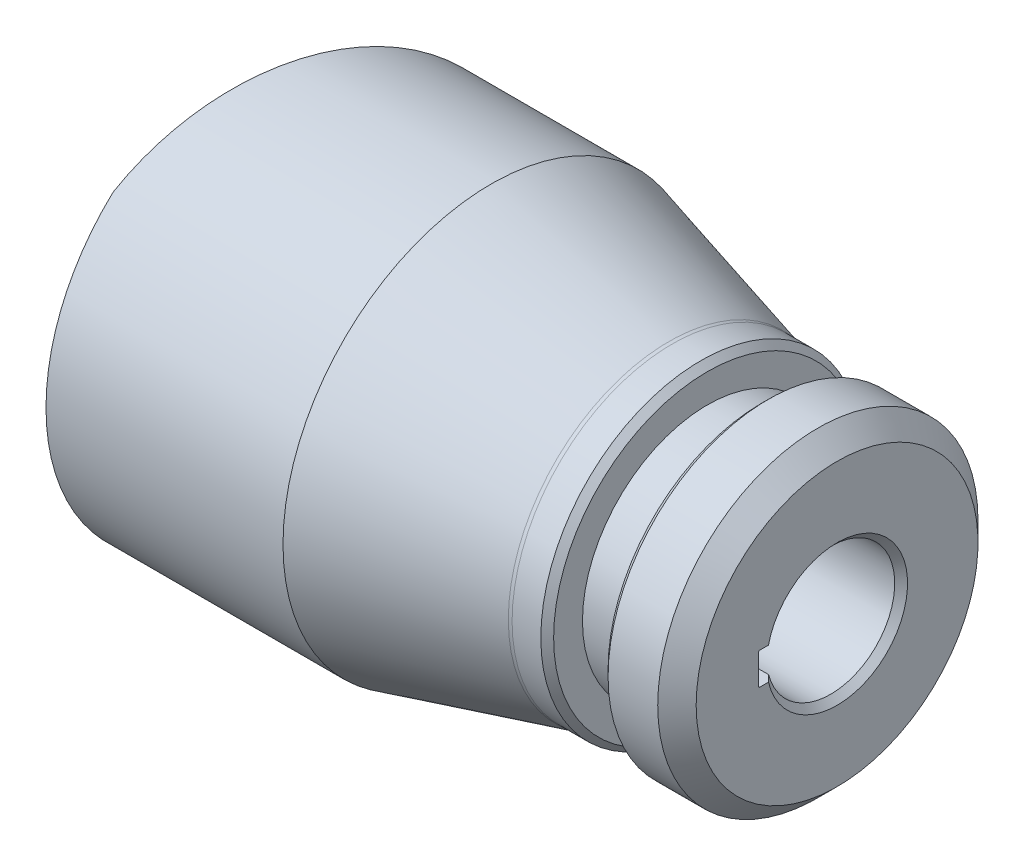
ISO-10303-21;
HEADER;
FILE_DESCRIPTION(('STEP AP214'),'2;1');
FILE_NAME('part.step','',(''),(''),'','','');
FILE_SCHEMA(('AUTOMOTIVE_DESIGN { 1 0 10303 214 1 1 1 1 }'));
ENDSEC;
DATA;
#1=APPLICATION_CONTEXT('core data for automotive mechanical design processes');
#2=APPLICATION_PROTOCOL_DEFINITION('international standard','automotive_design',2000,#1);
#3=PRODUCT_CONTEXT('',#1,'mechanical');
#4=PRODUCT('Part','Part','',(#3));
#5=PRODUCT_RELATED_PRODUCT_CATEGORY('part','',(#4));
#6=PRODUCT_DEFINITION_FORMATION('','',#4);
#7=PRODUCT_DEFINITION_CONTEXT('part definition',#1,'design');
#8=PRODUCT_DEFINITION('design','',#6,#7);
#9=PRODUCT_DEFINITION_SHAPE('','',#8);
#10=(LENGTH_UNIT() NAMED_UNIT(*) SI_UNIT(.MILLI.,.METRE.));
#11=(NAMED_UNIT(*) PLANE_ANGLE_UNIT() SI_UNIT($,.RADIAN.));
#12=(NAMED_UNIT(*) SI_UNIT($,.STERADIAN.) SOLID_ANGLE_UNIT());
#13=UNCERTAINTY_MEASURE_WITH_UNIT(LENGTH_MEASURE(1.E-05),#10,'distance_accuracy_value','');
#14=(GEOMETRIC_REPRESENTATION_CONTEXT(3) GLOBAL_UNCERTAINTY_ASSIGNED_CONTEXT((#13)) GLOBAL_UNIT_ASSIGNED_CONTEXT((#10,
#11,#12)) REPRESENTATION_CONTEXT('',''));
#15=CARTESIAN_POINT('',(0.,0.,0.));
#16=DIRECTION('',(0.,0.,1.));
#17=DIRECTION('',(1.,0.,0.));
#18=AXIS2_PLACEMENT_3D('',#15,#16,#17);
#19=CARTESIAN_POINT('',(61.,10.,0.));
#20=DIRECTION('',(1.,0.,0.));
#21=DIRECTION('',(0.,0.,-1.));
#22=AXIS2_PLACEMENT_3D('',#19,#20,#21);
#23=PLANE('',#22);
#24=CARTESIAN_POINT('',(61.,0.,0.));
#25=DIRECTION('',(-1.,0.,0.));
#26=DIRECTION('',(0.,0.,1.));
#27=AXIS2_PLACEMENT_3D('',#24,#25,#26);
#28=CIRCLE('',#27,19.);
#29=CARTESIAN_POINT('',(61.,0.,19.));
#30=VERTEX_POINT('',#29);
#31=EDGE_CURVE('E228',#30,#30,#28,.T.);
#32=ORIENTED_EDGE('',*,*,#31,.T.);
#33=EDGE_LOOP('',(#32));
#34=FACE_BOUND('',#33,.T.);
#35=CARTESIAN_POINT('',(61.,-2.25,12.05));
#36=DIRECTION('',(1.,0.,0.));
#37=DIRECTION('',(0.,0.,-1.));
#38=AXIS2_PLACEMENT_3D('',#35,#36,#37);
#39=CIRCLE('',#38,0.25);
#40=CARTESIAN_POINT('',(61.,-2.25,12.3));
#41=VERTEX_POINT('',#40);
#42=CARTESIAN_POINT('',(61.,-2.5,12.05));
#43=VERTEX_POINT('',#42);
#44=EDGE_CURVE('E137',#41,#43,#39,.T.);
#45=ORIENTED_EDGE('',*,*,#44,.T.);
#46=DIRECTION('',(0.,0.,-1.));
#47=VECTOR('',#46,1.);
#48=CARTESIAN_POINT('',(61.,-2.5,12.05));
#49=LINE('',#48,#47);
#50=CARTESIAN_POINT('',(61.,-2.5,9.68245836551854));
#51=VERTEX_POINT('',#50);
#52=EDGE_CURVE('E132',#43,#51,#49,.T.);
#53=ORIENTED_EDGE('',*,*,#52,.T.);
#54=CARTESIAN_POINT('',(61.,0.,0.));
#55=DIRECTION('',(-1.,0.,0.));
#56=DIRECTION('',(0.,0.,1.));
#57=AXIS2_PLACEMENT_3D('',#54,#55,#56);
#58=CIRCLE('',#57,10.);
#59=CARTESIAN_POINT('',(61.,2.5,9.68245836551854));
#60=VERTEX_POINT('',#59);
#61=EDGE_CURVE('E131',#60,#51,#58,.T.);
#62=ORIENTED_EDGE('',*,*,#61,.F.);
#63=DIRECTION('',(0.,0.,1.));
#64=VECTOR('',#63,1.);
#65=CARTESIAN_POINT('',(61.,2.5,0.));
#66=LINE('',#65,#64);
#67=CARTESIAN_POINT('',(61.,2.5,12.05));
#68=VERTEX_POINT('',#67);
#69=EDGE_CURVE('E115',#60,#68,#66,.T.);
#70=ORIENTED_EDGE('',*,*,#69,.T.);
#71=CARTESIAN_POINT('',(61.,2.25,12.05));
#72=DIRECTION('',(1.,0.,0.));
#73=DIRECTION('',(0.,0.,-1.));
#74=AXIS2_PLACEMENT_3D('',#71,#72,#73);
#75=CIRCLE('',#74,0.25);
#76=CARTESIAN_POINT('',(61.,2.25,12.3));
#77=VERTEX_POINT('',#76);
#78=EDGE_CURVE('E121',#68,#77,#75,.T.);
#79=ORIENTED_EDGE('',*,*,#78,.T.);
#80=DIRECTION('',(0.,-1.,0.));
#81=VECTOR('',#80,1.);
#82=CARTESIAN_POINT('',(61.,2.25,12.3));
#83=LINE('',#82,#81);
#84=EDGE_CURVE('E130',#77,#41,#83,.T.);
#85=ORIENTED_EDGE('',*,*,#84,.T.);
#86=EDGE_LOOP('',(#45,#53,#62,#70,#79,#85));
#87=FACE_BOUND('',#86,.T.);
#88=ADVANCED_FACE('F39',(#34,#87),#23,.F.);
#89=CARTESIAN_POINT('',(0.,0.,0.));
#90=DIRECTION('',(-1.,0.,0.));
#91=DIRECTION('',(0.,0.,1.));
#92=AXIS2_PLACEMENT_3D('',#89,#90,#91);
#93=CYLINDRICAL_SURFACE('',#92,10.);
#94=DIRECTION('',(-1.,0.,0.));
#95=VECTOR('',#94,1.);
#96=CARTESIAN_POINT('',(0.,-2.5,9.68245836551854));
#97=LINE('',#96,#95);
#98=CARTESIAN_POINT('',(90.,-2.5,9.68245836551854));
#99=VERTEX_POINT('',#98);
#100=EDGE_CURVE('E176',#99,#51,#97,.T.);
#101=ORIENTED_EDGE('',*,*,#100,.F.);
#102=CARTESIAN_POINT('',(90.,0.,0.));
#103=DIRECTION('',(-1.,0.,0.));
#104=DIRECTION('',(0.,0.,1.));
#105=AXIS2_PLACEMENT_3D('',#102,#103,#104);
#106=CIRCLE('',#105,10.);
#107=CARTESIAN_POINT('',(90.,2.5,9.68245836551854));
#108=VERTEX_POINT('',#107);
#109=EDGE_CURVE('E225',#108,#99,#106,.T.);
#110=ORIENTED_EDGE('',*,*,#109,.F.);
#111=DIRECTION('',(-1.,0.,0.));
#112=VECTOR('',#111,1.);
#113=CARTESIAN_POINT('',(0.,2.5,9.68245836551854));
#114=LINE('',#113,#112);
#115=EDGE_CURVE('E155',#60,#108,#114,.F.);
#116=ORIENTED_EDGE('',*,*,#115,.F.);
#117=ORIENTED_EDGE('',*,*,#61,.T.);
#118=EDGE_LOOP('',(#101,#110,#116,#117));
#119=FACE_BOUND('',#118,.T.);
#120=ADVANCED_FACE('F266',(#119),#93,.F.);
#121=CARTESIAN_POINT('',(90.,0.,0.));
#122=DIRECTION('',(1.,0.,0.));
#123=DIRECTION('',(0.,0.,-1.));
#124=AXIS2_PLACEMENT_3D('',#121,#122,#123);
#125=CONICAL_SURFACE('',#124,10.,0.785398163397447);
#126=CARTESIAN_POINT('',(102.045561017187,-2.5,21.9033504414856));
#127=CARTESIAN_POINT('',(101.449870446215,-2.5,21.3037783460764));
#128=CARTESIAN_POINT('',(100.854324898053,-2.5,20.7040619931697));
#129=CARTESIAN_POINT('',(99.6635375559575,-2.5,19.5041110312237));
#130=CARTESIAN_POINT('',(99.0682958370964,-2.5,18.9038763476916));
#131=CARTESIAN_POINT('',(97.8760221457398,-2.5,17.7005309154406));
#132=CARTESIAN_POINT('',(97.2789922658939,-2.5,17.0974180929501));
#133=CARTESIAN_POINT('',(96.0857744996463,-2.5,15.8905745919997));
#134=CARTESIAN_POINT('',(95.4895864810006,-2.5,15.2868440443333));
#135=CARTESIAN_POINT('',(94.4346485898976,-2.5,14.2167217543766));
#136=CARTESIAN_POINT('',(93.9756881287908,-2.5,13.7505376591703));
#137=CARTESIAN_POINT('',(93.0585903370607,-2.5,12.8173416722738));
#138=CARTESIAN_POINT('',(92.6004530233315,-2.5,12.3503297639757));
#139=CARTESIAN_POINT('',(91.6850309742706,-2.5,11.4148702783134));
#140=CARTESIAN_POINT('',(91.2277469954926,-2.5,10.9464219600604));
#141=CARTESIAN_POINT('',(90.3148861875787,-2.5,10.0079342569333));
#142=CARTESIAN_POINT('',(89.8593092298857,-2.5,9.53789499716365));
#143=CARTESIAN_POINT('',(88.9523494751294,-2.5,8.59711263543488));
#144=CARTESIAN_POINT('',(88.5009574133,-2.5,8.12637848838384));
#145=CARTESIAN_POINT('',(87.8269019453231,-2.5,7.4172560158198));
#146=CARTESIAN_POINT('',(87.6026883899942,-2.5,7.18034208959313));
#147=CARTESIAN_POINT('',(87.1556525924263,-2.5,6.70521258252492));
#148=CARTESIAN_POINT('',(86.9328303232039,-2.5,6.46699702709683));
#149=CARTESIAN_POINT('',(86.4893544719267,-2.5,5.98912775716134));
#150=CARTESIAN_POINT('',(86.2686984487696,-2.5,5.74947631274653));
#151=CARTESIAN_POINT('',(85.8300192665262,-2.5,5.26773614577968));
#152=CARTESIAN_POINT('',(85.6119963259971,-2.5,5.02564722392351));
#153=CARTESIAN_POINT('',(85.1799421292042,-2.5,4.53813526469688));
#154=CARTESIAN_POINT('',(84.9659088435389,-2.5,4.29271403860861));
#155=CARTESIAN_POINT('',(84.6494717760518,-2.5,3.92068538051081));
#156=CARTESIAN_POINT('',(84.544768684024,-2.5,3.7960351611092));
#157=CARTESIAN_POINT('',(84.3373550207405,-2.5,3.54509019573787));
#158=CARTESIAN_POINT('',(84.2346443575069,-2.5,3.41879552613407));
#159=CARTESIAN_POINT('',(84.0949780157451,-2.5,3.24340610425404));
#160=CARTESIAN_POINT('',(84.0568990373237,-2.5,3.19520488318342));
#161=CARTESIAN_POINT('',(83.9811594306527,-2.5,3.0984732096231));
#162=CARTESIAN_POINT('',(83.9434988117545,-2.5,3.04994274981301));
#163=CARTESIAN_POINT('',(83.8312131001724,-2.5,2.9038061080311));
#164=CARTESIAN_POINT('',(83.7572879230694,-2.5,2.80565938066392));
#165=CARTESIAN_POINT('',(83.6116206604259,-2.5,2.60736322707545));
#166=CARTESIAN_POINT('',(83.5398846990809,-2.5,2.50720928734453));
#167=CARTESIAN_POINT('',(83.3994981168775,-2.5,2.30475848848419));
#168=CARTESIAN_POINT('',(83.3308473157947,-2.5,2.20246175504244));
#169=CARTESIAN_POINT('',(83.1996821734027,-2.5,1.99846925459172));
#170=CARTESIAN_POINT('',(83.1370432716504,-2.5,1.89685410017203));
#171=CARTESIAN_POINT('',(83.0168053808059,-2.5,1.6906036686147));
#172=CARTESIAN_POINT('',(82.9592082432841,-2.5,1.58596730055157));
#173=CARTESIAN_POINT('',(82.851057399586,-2.5,1.37362506179184));
#174=CARTESIAN_POINT('',(82.800475315056,-2.5,1.26593381571607));
#175=CARTESIAN_POINT('',(82.7084728205532,-2.5,1.04675068999883));
#176=CARTESIAN_POINT('',(82.6670418539287,-2.5,0.93526336273527));
#177=CARTESIAN_POINT('',(82.6090268657202,-2.5,0.74949796271908));
#178=CARTESIAN_POINT('',(82.5888746879037,-2.5,0.676335800473273));
#179=CARTESIAN_POINT('',(82.5542738118671,-2.5,0.528644072222774));
#180=CARTESIAN_POINT('',(82.5398257733874,-2.5,0.454114349088667));
#181=CARTESIAN_POINT('',(82.5173797387102,-2.5,0.304389254153665));
#182=CARTESIAN_POINT('',(82.5093555155451,-2.5,0.229197869332127));
#183=CARTESIAN_POINT('',(82.5000968878634,-2.5,0.0783950146710749));
#184=CARTESIAN_POINT('',(82.4988621261968,-2.5,0.0027835671378271));
#185=CARTESIAN_POINT('',(82.5032552583313,-2.5,-0.148311352858782));
#186=CARTESIAN_POINT('',(82.5088899423716,-2.5,-0.223794624722243));
#187=CARTESIAN_POINT('',(82.5267161267743,-2.5,-0.373974966506095));
#188=CARTESIAN_POINT('',(82.5389080647435,-2.5,-0.448671983615511));
#189=CARTESIAN_POINT('',(82.5692990787695,-2.5,-0.597167582870771));
#190=CARTESIAN_POINT('',(82.5875248464607,-2.5,-0.670960634354447));
#191=CARTESIAN_POINT('',(82.6291922122467,-2.5,-0.817036970277688));
#192=CARTESIAN_POINT('',(82.6526340214481,-2.5,-0.889320193481054));
#193=CARTESIAN_POINT('',(82.7388087960089,-2.5,-1.12958668720317));
#194=CARTESIAN_POINT('',(82.811608747054,-2.5,-1.29398154860926));
#195=CARTESIAN_POINT('',(82.9325594311706,-2.5,-1.53449963527309));
#196=CARTESIAN_POINT('',(82.9748938967031,-2.5,-1.61375333975097));
#197=CARTESIAN_POINT('',(83.0627425706191,-2.5,-1.77048277937609));
#198=CARTESIAN_POINT('',(83.108256220561,-2.5,-1.84795882361883));
#199=CARTESIAN_POINT('',(83.2021464788311,-2.5,-2.00187005218244));
#200=CARTESIAN_POINT('',(83.2505405929618,-2.5,-2.07829444291589));
#201=CARTESIAN_POINT('',(83.3494205783412,-2.5,-2.22977791758439));
#202=CARTESIAN_POINT('',(83.3999065034323,-2.5,-2.3048369663043));
#203=CARTESIAN_POINT('',(83.502529566732,-2.5,-2.4536947089672));
#204=CARTESIAN_POINT('',(83.5546648735071,-2.5,-2.52749466982519));
#205=CARTESIAN_POINT('',(83.6603416359775,-2.5,-2.67407422188183));
#206=CARTESIAN_POINT('',(83.7138830420523,-2.5,-2.74685384894895));
#207=CARTESIAN_POINT('',(83.8878377808231,-2.5,-2.97936805377215));
#208=CARTESIAN_POINT('',(84.0105237004975,-2.5,-3.13740244992337));
#209=CARTESIAN_POINT('',(84.2598180841568,-2.5,-3.45035538054898));
#210=CARTESIAN_POINT('',(84.3864271123722,-2.5,-3.60527346149401));
#211=CARTESIAN_POINT('',(84.6425145204182,-2.5,-3.91282383803164));
#212=CARTESIAN_POINT('',(84.771994080099,-2.5,-4.06545514884034));
#213=CARTESIAN_POINT('',(85.0330425368542,-2.5,-4.36892349220322));
#214=CARTESIAN_POINT('',(85.1646115000773,-2.5,-4.51976046768493));
#215=CARTESIAN_POINT('',(85.4295419798155,-2.5,-4.82026565445455));
#216=CARTESIAN_POINT('',(85.5629059597752,-2.5,-4.96993169049384));
#217=CARTESIAN_POINT('',(85.8308764891571,-2.5,-5.2681481340376));
#218=CARTESIAN_POINT('',(85.9654830503867,-2.5,-5.41669853091656));
#219=CARTESIAN_POINT('',(86.3706936253748,-2.5,-5.86093576973548));
#220=CARTESIAN_POINT('',(86.6427595030003,-2.5,-6.15528855637171));
#221=CARTESIAN_POINT('',(87.1885779611658,-2.5,-6.74067580384861));
#222=CARTESIAN_POINT('',(87.462322460928,-2.5,-7.0317178258461));
#223=CARTESIAN_POINT('',(88.0116063644491,-2.5,-7.61213662900406));
#224=CARTESIAN_POINT('',(88.2871458804375,-2.5,-7.90151330387));
#225=CARTESIAN_POINT('',(88.8393191206114,-2.5,-8.47883478347782));
#226=CARTESIAN_POINT('',(89.1159519520669,-2.5,-8.76678044300963));
#227=CARTESIAN_POINT('',(89.6701787524352,-2.5,-9.34174536244209));
#228=CARTESIAN_POINT('',(89.9477727221698,-2.5,-9.62876462155022));
#229=CARTESIAN_POINT('',(90.3171746668332,-2.5,-10.0097262565819));
#230=CARTESIAN_POINT('',(90.4086536315667,-2.5,-10.1039879493731));
#231=CARTESIAN_POINT('',(90.5916929793254,-2.5,-10.2924469787721));
#232=CARTESIAN_POINT('',(90.6832533682993,-2.5,-10.3866443096035));
#233=CARTESIAN_POINT('',(90.866469806922,-2.5,-10.5750008769896));
#234=CARTESIAN_POINT('',(90.9581258770255,-2.5,-10.6691600936455));
#235=CARTESIAN_POINT('',(91.1414938389912,-2.5,-10.8574093402639));
#236=CARTESIAN_POINT('',(91.233205725748,-2.5,-10.9514993751995));
#237=CARTESIAN_POINT('',(91.324946718833,-2.5,-11.0455610171873));
#238=B_SPLINE_CURVE_WITH_KNOTS('',3,(#126,#127,#128,#129,#130,#131,#132,#133,#134,#135,#136,
#137,#138,#139,#140,#141,#142,#143,#144,#145,#146,#147,#148,#149,#150,#151,#152,#153,#154,#155,
#156,#157,#158,#159,#160,#161,#162,#163,#164,#165,#166,#167,#168,#169,#170,#171,#172,#173,#174,
#175,#176,#177,#178,#179,#180,#181,#182,#183,#184,#185,#186,#187,#188,#189,#190,#191,#192,#193,
#194,#195,#196,#197,#198,#199,#200,#201,#202,#203,#204,#205,#206,#207,#208,#209,#210,#211,#212,
#213,#214,#215,#216,#217,#218,#219,#220,#221,#222,#223,#224,#225,#226,#227,#228,#229,#230,#231,
#232,#233,#234,#235,#236,#237),.UNSPECIFIED.,.F.,.F.,(4,2,2,2,2,2,2,2,2,2,2,2,2,2,2,2,2,2,2,2,2,
2,2,2,2,2,2,2,2,2,2,2,2,2,2,2,2,2,2,2,2,2,2,2,2,2,2,2,2,2,2,2,2,2,2,4),(0.,2.53554854250261,
5.07155885147493,7.61747825214947,10.1629392698724,12.1255262999428,14.08815315979,
16.0520676504545,18.0158311382299,19.9723683022417,20.9509342989017,21.9294812574857,
22.9067571031813,23.884113516999,24.8609584134011,25.3493129498761,25.8376448881797,
26.0219261080066,26.2062114387111,26.5748002136115,26.9443399107132,27.3138579924631,
27.6718609859281,28.0299949079246,28.3866349314927,28.7428613641364,28.9703313064979,
29.1978275503193,29.424390173276,29.650940878109,29.8777157031423,30.1045056641634,
30.3323125806441,30.5601287187352,31.0978773208622,31.3674130075624,31.6369014673016,
31.908239552422,32.1795846260495,32.4506383064768,32.7216824343584,33.3217776621176,
33.921959601275,34.5223929774751,35.1228454008901,35.7242289945911,36.3256183087157,
37.5280763654771,38.7267226419803,39.9254445946254,41.1233341148939,42.3212246596831,
42.7152842986935,43.1093755845909,43.5035850678365,43.8977627169515),.UNSPECIFIED.);
#239=CARTESIAN_POINT('',(91.,-2.5,10.7121426428143));
#240=VERTEX_POINT('',#239);
#241=EDGE_CURVE('E168',#240,#99,#238,.T.);
#242=ORIENTED_EDGE('',*,*,#241,.F.);
#243=CARTESIAN_POINT('',(91.,0.,0.));
#244=DIRECTION('',(-1.,0.,0.));
#245=DIRECTION('',(0.,0.,1.));
#246=AXIS2_PLACEMENT_3D('',#243,#244,#245);
#247=CIRCLE('',#246,11.);
#248=CARTESIAN_POINT('',(91.,2.5,10.7121426428143));
#249=VERTEX_POINT('',#248);
#250=EDGE_CURVE('E218',#249,#240,#247,.T.);
#251=ORIENTED_EDGE('',*,*,#250,.F.);
#252=CARTESIAN_POINT('',(91.324946718833,2.5,-11.0455610171873));
#253=CARTESIAN_POINT('',(91.0264872076435,2.5,-10.7395256999951));
#254=CARTESIAN_POINT('',(90.7283116424926,2.5,-10.4332122092368));
#255=CARTESIAN_POINT('',(90.1327500336678,2.5,-9.81978495868333));
#256=CARTESIAN_POINT('',(89.8353640359402,2.5,-9.51267115429152));
#257=CARTESIAN_POINT('',(89.240959113721,2.5,-8.89673146577438));
#258=CARTESIAN_POINT('',(88.943942579579,2.5,-8.58790327325961));
#259=CARTESIAN_POINT('',(88.3513559475128,2.5,-7.96888841905438));
#260=CARTESIAN_POINT('',(88.0557857823271,2.5,-7.65870182183074));
#261=CARTESIAN_POINT('',(87.4537653644763,2.5,-7.02278984034606));
#262=CARTESIAN_POINT('',(87.1474054729947,2.5,-6.6969788350244));
#263=CARTESIAN_POINT('',(86.5379126253516,2.5,-6.04224922304472));
#264=CARTESIAN_POINT('',(86.234780147433,2.5,-5.71333016909498));
#265=CARTESIAN_POINT('',(85.7842342634438,2.5,-5.21652610534034));
#266=CARTESIAN_POINT('',(85.6348284484134,2.5,-5.05044950544328));
#267=CARTESIAN_POINT('',(85.3377706338616,2.5,-4.71673691747359));
#268=CARTESIAN_POINT('',(85.1901186024667,2.5,-4.54910095783998));
#269=CARTESIAN_POINT('',(84.8971949044248,2.5,-4.21182900344743));
#270=CARTESIAN_POINT('',(84.7519226757172,2.5,-4.04219349770228));
#271=CARTESIAN_POINT('',(84.464622272545,2.5,-3.70020282272686));
#272=CARTESIAN_POINT('',(84.3225938333821,2.5,-3.52784787736185));
#273=CARTESIAN_POINT('',(84.1284670508829,2.5,-3.28570678840755));
#274=CARTESIAN_POINT('',(84.0743810891246,2.5,-3.21751403348742));
#275=CARTESIAN_POINT('',(83.9670491665562,2.5,-3.08046981518376));
#276=CARTESIAN_POINT('',(83.9138032172655,2.5,-3.01161834278778));
#277=CARTESIAN_POINT('',(83.7554983903631,2.5,-2.8038986038655));
#278=CARTESIAN_POINT('',(83.6519033689274,2.5,-2.66390318690655));
#279=CARTESIAN_POINT('',(83.4504837086314,2.5,-2.38029171591086));
#280=CARTESIAN_POINT('',(83.352646089999,2.5,-2.23668493659416));
#281=CARTESIAN_POINT('',(83.165062902916,2.5,-1.94428749240061));
#282=CARTESIAN_POINT('',(83.0753128044882,2.5,-1.79549979502898));
#283=CARTESIAN_POINT('',(82.9479157288535,2.5,-1.56352283046052));
#284=CARTESIAN_POINT('',(82.9057978086178,2.5,-1.48280885282083));
#285=CARTESIAN_POINT('',(82.8258494063597,2.5,-1.31929389468974));
#286=CARTESIAN_POINT('',(82.788019757904,2.5,-1.23649251225311));
#287=CARTESIAN_POINT('',(82.682746618178,2.5,-0.984983944724189));
#288=CARTESIAN_POINT('',(82.6232158308722,2.5,-0.812648480153105));
#289=CARTESIAN_POINT('',(82.5620315512805,2.5,-0.564670141277329));
#290=CARTESIAN_POINT('',(82.5469881264684,2.5,-0.492267812610079));
#291=CARTESIAN_POINT('',(82.5228705971666,2.5,-0.346461869982659));
#292=CARTESIAN_POINT('',(82.5137956104057,2.5,-0.273058405651397));
#293=CARTESIAN_POINT('',(82.5020891370418,2.5,-0.125814800388735));
#294=CARTESIAN_POINT('',(82.49945063952,2.5,-0.0519752224862423));
#295=CARTESIAN_POINT('',(82.5007400953475,2.5,0.0956488420215832));
#296=CARTESIAN_POINT('',(82.5046682627275,2.5,0.169433326752817));
#297=CARTESIAN_POINT('',(82.5188519310274,2.5,0.316112946878502));
#298=CARTESIAN_POINT('',(82.5290845487675,2.5,0.389010330713581));
#299=CARTESIAN_POINT('',(82.5553522179659,2.5,0.533755748715104));
#300=CARTESIAN_POINT('',(82.5713886925071,2.5,0.605603521021994));
#301=CARTESIAN_POINT('',(82.608613890447,2.5,0.748068073568038));
#302=CARTESIAN_POINT('',(82.6298114280324,2.5,0.818682524015744));
#303=CARTESIAN_POINT('',(82.6766074057769,2.5,0.958416472111447));
#304=CARTESIAN_POINT('',(82.702205609798,2.5,1.02753604974985));
#305=CARTESIAN_POINT('',(82.7690889539855,2.5,1.1941338484557));
#306=CARTESIAN_POINT('',(82.8123437215069,2.5,1.29081901114142));
#307=CARTESIAN_POINT('',(82.9047330688297,2.5,1.48135829785574));
#308=CARTESIAN_POINT('',(82.9538709852571,2.5,1.57521077718962));
#309=CARTESIAN_POINT('',(83.056757209002,2.5,1.76060266320425));
#310=CARTESIAN_POINT('',(83.1105153562385,2.5,1.85213656724629));
#311=CARTESIAN_POINT('',(83.2215091626245,2.5,2.03303196308019));
#312=CARTESIAN_POINT('',(83.2787441610631,2.5,2.12239386313003));
#313=CARTESIAN_POINT('',(83.396472772813,2.5,2.30010785455569));
#314=CARTESIAN_POINT('',(83.4569912853469,2.5,2.38844337389955));
#315=CARTESIAN_POINT('',(83.5802248388906,2.5,2.56356740759901));
#316=CARTESIAN_POINT('',(83.6429399571936,2.5,2.65035586735488));
#317=CARTESIAN_POINT('',(83.7700428684859,2.5,2.82251489467904));
#318=CARTESIAN_POINT('',(83.8344282920167,2.5,2.90788721633357));
#319=CARTESIAN_POINT('',(83.9646245473037,2.5,3.07753049630983));
#320=CARTESIAN_POINT('',(84.0304353303801,2.5,3.16180149208773));
#321=CARTESIAN_POINT('',(84.2485695576563,2.5,3.43716353705055));
#322=CARTESIAN_POINT('',(84.4033487308776,2.5,3.62630869256808));
#323=CARTESIAN_POINT('',(84.7169317793855,2.5,4.00124114897501));
#324=CARTESIAN_POINT('',(84.8757361207144,2.5,4.18702805673399));
#325=CARTESIAN_POINT('',(85.1962160599706,2.5,4.55621051523594));
#326=CARTESIAN_POINT('',(85.3578925812074,2.5,4.73960526287758));
#327=CARTESIAN_POINT('',(85.6832933472581,2.5,5.10457000516818));
#328=CARTESIAN_POINT('',(85.8470176287429,2.5,5.28613996703398));
#329=CARTESIAN_POINT('',(86.1762229544659,2.5,5.64813248817901));
#330=CARTESIAN_POINT('',(86.3417060955326,2.5,5.82855313804915));
#331=CARTESIAN_POINT('',(86.673855857512,2.5,6.18830389501986));
#332=CARTESIAN_POINT('',(86.8405224907561,2.5,6.36763399072128));
#333=CARTESIAN_POINT('',(87.3418285009866,2.5,6.90426382175186));
#334=CARTESIAN_POINT('',(87.6778429431362,2.5,7.26027844871709));
#335=CARTESIAN_POINT('',(88.3501416787804,2.5,7.96786303434974));
#336=CARTESIAN_POINT('',(88.6864114140159,2.5,8.31944686452891));
#337=CARTESIAN_POINT('',(89.3605809022521,2.5,9.02108172216437));
#338=CARTESIAN_POINT('',(89.6984807373123,2.5,9.37113267072663));
#339=CARTESIAN_POINT('',(90.3752045818812,2.5,10.0698766221887));
#340=CARTESIAN_POINT('',(90.7140278038831,2.5,10.4185703884251));
#341=CARTESIAN_POINT('',(91.392526097637,2.5,11.115117762963));
#342=CARTESIAN_POINT('',(91.7322011567124,2.5,11.4629713836178));
#343=CARTESIAN_POINT('',(92.4845687547211,2.5,12.2320108764457));
#344=CARTESIAN_POINT('',(92.8974146866384,2.5,12.6530466384443));
#345=CARTESIAN_POINT('',(93.7238191781225,2.5,13.4944215464866));
#346=CARTESIAN_POINT('',(94.1373777407934,2.5,13.9147606894802));
#347=CARTESIAN_POINT('',(95.3790536830222,2.5,15.17518830171));
#348=CARTESIAN_POINT('',(96.2079740135092,2.5,16.0144856480676));
#349=CARTESIAN_POINT('',(97.8712770869717,2.5,17.6959779203467));
#350=CARTESIAN_POINT('',(98.7056664094186,2.5,18.5381663331123));
#351=CARTESIAN_POINT('',(99.9578113322211,2.5,19.8006843471737));
#352=CARTESIAN_POINT('',(100.375234375045,2.5,20.2213438420664));
#353=CARTESIAN_POINT('',(101.210266712846,2.5,21.0624774530978));
#354=CARTESIAN_POINT('',(101.627876007715,2.5,21.4829515693434));
#355=CARTESIAN_POINT('',(102.045561017187,2.5,21.9033504414856));
#356=B_SPLINE_CURVE_WITH_KNOTS('',3,(#252,#253,#254,#255,#256,#257,#258,#259,#260,#261,#262,
#263,#264,#265,#266,#267,#268,#269,#270,#271,#272,#273,#274,#275,#276,#277,#278,#279,#280,#281,
#282,#283,#284,#285,#286,#287,#288,#289,#290,#291,#292,#293,#294,#295,#296,#297,#298,#299,#300,
#301,#302,#303,#304,#305,#306,#307,#308,#309,#310,#311,#312,#313,#314,#315,#316,#317,#318,#319,
#320,#321,#322,#323,#324,#325,#326,#327,#328,#329,#330,#331,#332,#333,#334,#335,#336,#337,#338,
#339,#340,#341,#342,#343,#344,#345,#346,#347,#348,#349,#350,#351,#352,#353,#354,#355),
.UNSPECIFIED.,.F.,.F.,(4,2,2,2,2,2,2,2,2,2,2,2,2,2,2,2,2,2,2,2,2,2,2,2,2,2,2,2,2,2,2,2,2,2,2,2,
2,2,2,2,2,2,2,2,2,2,2,2,2,2,2,4),(0.,1.28242905949621,2.56493117830289,3.85036297343735,
5.13573441203459,6.47739444809818,7.81925060120181,8.48941487904222,9.15956695854572,
9.82955841108419,10.4994949945004,10.7606018720145,11.0217123270701,11.5440804048788,
12.0652217603739,12.5860693760987,12.8590728547271,13.1321293098985,13.6764349544331,
13.8980803070749,14.11969288811,14.3410639705764,14.5624422684444,14.783021728054,
15.0036553095655,15.2246683704846,15.4456695756223,15.7631522991369,16.0808159435135,
16.3991737415265,16.7174712296704,17.0386631373686,17.3598663584041,17.680636469648,
18.0013956429425,18.7345035471117,19.4676967232841,20.2011300217109,20.934576473152,
21.6690262650512,22.403483720725,23.8720922374743,25.3316057200061,26.7911934577999,
28.2497856993581,29.7083563622546,31.4773706973252,33.2463927576,36.7852824960725,
40.3418786679764,42.1197334091946,43.8975871226463),.UNSPECIFIED.);
#357=EDGE_CURVE('E120',#108,#249,#356,.T.);
#358=ORIENTED_EDGE('',*,*,#357,.F.);
#359=ORIENTED_EDGE('',*,*,#109,.T.);
#360=EDGE_LOOP('',(#242,#251,#358,#359));
#361=FACE_BOUND('',#360,.T.);
#362=ADVANCED_FACE('F152',(#361),#125,.F.);
#363=CARTESIAN_POINT('',(0.,27.5,0.));
#364=DIRECTION('',(1.,0.,0.));
#365=DIRECTION('',(0.,0.,-1.));
#366=AXIS2_PLACEMENT_3D('',#363,#364,#365);
#367=PLANE('',#366);
#368=CARTESIAN_POINT('',(0.,0.,0.));
#369=DIRECTION('',(-1.,0.,0.));
#370=DIRECTION('',(0.,0.,1.));
#371=AXIS2_PLACEMENT_3D('',#368,#369,#370);
#372=CIRCLE('',#371,32.5);
#373=CARTESIAN_POINT('',(0.,-23.9217474278114,22.));
#374=VERTEX_POINT('',#373);
#375=CARTESIAN_POINT('',(0.,23.9217474278114,22.));
#376=VERTEX_POINT('',#375);
#377=EDGE_CURVE('E181',#374,#376,#372,.T.);
#378=ORIENTED_EDGE('',*,*,#377,.T.);
#379=DIRECTION('',(0.,-1.,0.));
#380=VECTOR('',#379,1.);
#381=CARTESIAN_POINT('',(0.,27.5,22.));
#382=LINE('',#381,#380);
#383=CARTESIAN_POINT('',(0.,16.5,22.));
#384=VERTEX_POINT('',#383);
#385=EDGE_CURVE('E182',#376,#384,#382,.T.);
#386=ORIENTED_EDGE('',*,*,#385,.T.);
#387=CARTESIAN_POINT('',(0.,0.,0.));
#388=DIRECTION('',(-1.,0.,0.));
#389=DIRECTION('',(0.,0.,1.));
#390=AXIS2_PLACEMENT_3D('',#387,#388,#389);
#391=CIRCLE('',#390,27.5);
#392=CARTESIAN_POINT('',(0.,-16.5,22.));
#393=VERTEX_POINT('',#392);
#394=EDGE_CURVE('E243',#393,#384,#391,.T.);
#395=ORIENTED_EDGE('',*,*,#394,.F.);
#396=EDGE_CURVE('E178',#393,#374,#382,.T.);
#397=ORIENTED_EDGE('',*,*,#396,.T.);
#398=EDGE_LOOP('',(#378,#386,#395,#397));
#399=FACE_BOUND('',#398,.T.);
#400=ADVANCED_FACE('F41',(#399),#367,.F.);
#401=CARTESIAN_POINT('',(0.,0.,0.));
#402=DIRECTION('',(-1.,0.,0.));
#403=DIRECTION('',(0.,0.,1.));
#404=AXIS2_PLACEMENT_3D('',#401,#402,#403);
#405=CYLINDRICAL_SURFACE('',#404,27.5);
#406=CARTESIAN_POINT('',(24.6,0.,0.));
#407=DIRECTION('',(-1.,0.,0.));
#408=DIRECTION('',(0.,0.,1.));
#409=AXIS2_PLACEMENT_3D('',#406,#407,#408);
#410=CIRCLE('',#409,27.5);
#411=CARTESIAN_POINT('',(24.6,0.,27.5));
#412=VERTEX_POINT('',#411);
#413=EDGE_CURVE('E236',#412,#412,#410,.T.);
#414=ORIENTED_EDGE('',*,*,#413,.F.);
#415=EDGE_LOOP('',(#414));
#416=FACE_BOUND('',#415,.T.);
#417=ORIENTED_EDGE('',*,*,#394,.T.);
#418=CARTESIAN_POINT('',(4.67624435674049,0.,0.));
#419=DIRECTION('',(0.978147600733805,0.,0.207911690817759));
#420=DIRECTION('',(-0.207911690817759,0.,0.978147600733806));
#421=AXIS2_PLACEMENT_3D('',#418,#419,#420);
#422=ELLIPSE('',#421,28.1143663587883,27.5);
#423=EDGE_CURVE('E65',#384,#393,#422,.F.);
#424=ORIENTED_EDGE('',*,*,#423,.T.);
#425=EDGE_LOOP('',(#417,#424));
#426=FACE_BOUND('',#425,.T.);
#427=ADVANCED_FACE('F280',(#416,#426),#405,.F.);
#428=CARTESIAN_POINT('',(24.6,0.,0.));
#429=DIRECTION('',(-1.,0.,0.));
#430=DIRECTION('',(0.,0.,1.));
#431=AXIS2_PLACEMENT_3D('',#428,#429,#430);
#432=TOROIDAL_SURFACE('',#431,27.1,0.399999999999999);
#433=CARTESIAN_POINT('',(25.,0.,0.));
#434=DIRECTION('',(-1.,0.,0.));
#435=DIRECTION('',(0.,0.,1.));
#436=AXIS2_PLACEMENT_3D('',#433,#434,#435);
#437=CIRCLE('',#436,27.1);
#438=CARTESIAN_POINT('',(25.,0.,27.1));
#439=VERTEX_POINT('',#438);
#440=EDGE_CURVE('E234',#439,#439,#437,.T.);
#441=ORIENTED_EDGE('',*,*,#440,.F.);
#442=EDGE_LOOP('',(#441));
#443=FACE_BOUND('',#442,.T.);
#444=ORIENTED_EDGE('',*,*,#413,.T.);
#445=EDGE_LOOP('',(#444));
#446=FACE_BOUND('',#445,.T.);
#447=ADVANCED_FACE('F300',(#443,#446),#432,.F.);
#448=CARTESIAN_POINT('',(25.,20.,0.));
#449=DIRECTION('',(1.,0.,0.));
#450=DIRECTION('',(0.,0.,-1.));
#451=AXIS2_PLACEMENT_3D('',#448,#449,#450);
#452=PLANE('',#451);
#453=CARTESIAN_POINT('',(25.,0.,0.));
#454=DIRECTION('',(-1.,0.,0.));
#455=DIRECTION('',(0.,0.,1.));
#456=AXIS2_PLACEMENT_3D('',#453,#454,#455);
#457=CIRCLE('',#456,20.);
#458=CARTESIAN_POINT('',(25.,0.,20.));
#459=VERTEX_POINT('',#458);
#460=EDGE_CURVE('E235',#459,#459,#457,.T.);
#461=ORIENTED_EDGE('',*,*,#460,.F.);
#462=EDGE_LOOP('',(#461));
#463=FACE_BOUND('',#462,.T.);
#464=ORIENTED_EDGE('',*,*,#440,.T.);
#465=EDGE_LOOP('',(#464));
#466=FACE_BOUND('',#465,.T.);
#467=ADVANCED_FACE('F291',(#463,#466),#452,.F.);
#468=CARTESIAN_POINT('',(0.,0.,0.));
#469=DIRECTION('',(-1.,0.,0.));
#470=DIRECTION('',(0.,0.,1.));
#471=AXIS2_PLACEMENT_3D('',#468,#469,#470);
#472=CYLINDRICAL_SURFACE('',#471,20.);
#473=CARTESIAN_POINT('',(60.,0.,0.));
#474=DIRECTION('',(-1.,0.,0.));
#475=DIRECTION('',(0.,0.,1.));
#476=AXIS2_PLACEMENT_3D('',#473,#474,#475);
#477=CIRCLE('',#476,20.);
#478=CARTESIAN_POINT('',(60.,0.,20.));
#479=VERTEX_POINT('',#478);
#480=EDGE_CURVE('E227',#479,#479,#477,.T.);
#481=ORIENTED_EDGE('',*,*,#480,.F.);
#482=EDGE_LOOP('',(#481));
#483=FACE_BOUND('',#482,.T.);
#484=ORIENTED_EDGE('',*,*,#460,.T.);
#485=EDGE_LOOP('',(#484));
#486=FACE_BOUND('',#485,.T.);
#487=ADVANCED_FACE('F287',(#483,#486),#472,.F.);
#488=CARTESIAN_POINT('',(60.,0.,0.));
#489=DIRECTION('',(-1.,0.,0.));
#490=DIRECTION('',(0.,0.,1.));
#491=AXIS2_PLACEMENT_3D('',#488,#489,#490);
#492=TOROIDAL_SURFACE('',#491,19.,1.);
#493=ORIENTED_EDGE('',*,*,#31,.F.);
#494=EDGE_LOOP('',(#493));
#495=FACE_BOUND('',#494,.T.);
#496=ORIENTED_EDGE('',*,*,#480,.T.);
#497=EDGE_LOOP('',(#496));
#498=FACE_BOUND('',#497,.T.);
#499=ADVANCED_FACE('F286',(#495,#498),#492,.F.);
#500=CARTESIAN_POINT('',(91.,22.,0.));
#501=DIRECTION('',(-1.,0.,0.));
#502=DIRECTION('',(0.,0.,1.));
#503=AXIS2_PLACEMENT_3D('',#500,#501,#502);
#504=PLANE('',#503);
#505=DIRECTION('',(0.,0.,-1.));
#506=VECTOR('',#505,1.);
#507=CARTESIAN_POINT('',(91.,-2.5,0.));
#508=LINE('',#507,#506);
#509=CARTESIAN_POINT('',(91.,-2.5,12.05));
#510=VERTEX_POINT('',#509);
#511=EDGE_CURVE('E11',#510,#240,#508,.T.);
#512=ORIENTED_EDGE('',*,*,#511,.F.);
#513=CARTESIAN_POINT('',(91.,-2.25,12.05));
#514=DIRECTION('',(-1.,0.,0.));
#515=DIRECTION('',(0.,0.,1.));
#516=AXIS2_PLACEMENT_3D('',#513,#514,#515);
#517=CIRCLE('',#516,0.25);
#518=CARTESIAN_POINT('',(91.,-2.25,12.3));
#519=VERTEX_POINT('',#518);
#520=EDGE_CURVE('E250',#519,#510,#517,.F.);
#521=ORIENTED_EDGE('',*,*,#520,.F.);
#522=DIRECTION('',(0.,-1.,0.));
#523=VECTOR('',#522,1.);
#524=CARTESIAN_POINT('',(91.,22.,12.3));
#525=LINE('',#524,#523);
#526=CARTESIAN_POINT('',(91.,2.25,12.3));
#527=VERTEX_POINT('',#526);
#528=EDGE_CURVE('E247',#527,#519,#525,.T.);
#529=ORIENTED_EDGE('',*,*,#528,.F.);
#530=CARTESIAN_POINT('',(91.,2.25,12.05));
#531=DIRECTION('',(-1.,0.,0.));
#532=DIRECTION('',(0.,0.,1.));
#533=AXIS2_PLACEMENT_3D('',#530,#531,#532);
#534=CIRCLE('',#533,0.25);
#535=CARTESIAN_POINT('',(91.,2.5,12.05));
#536=VERTEX_POINT('',#535);
#537=EDGE_CURVE('E253',#536,#527,#534,.F.);
#538=ORIENTED_EDGE('',*,*,#537,.F.);
#539=DIRECTION('',(0.,0.,1.));
#540=VECTOR('',#539,1.);
#541=CARTESIAN_POINT('',(91.,2.5,0.));
#542=LINE('',#541,#540);
#543=EDGE_CURVE('E50',#249,#536,#542,.T.);
#544=ORIENTED_EDGE('',*,*,#543,.F.);
#545=ORIENTED_EDGE('',*,*,#250,.T.);
#546=EDGE_LOOP('',(#512,#521,#529,#538,#544,#545));
#547=FACE_BOUND('',#546,.T.);
#548=CARTESIAN_POINT('',(91.,0.,0.));
#549=DIRECTION('',(-1.,0.,0.));
#550=DIRECTION('',(0.,0.,1.));
#551=AXIS2_PLACEMENT_3D('',#548,#549,#550);
#552=CIRCLE('',#551,22.);
#553=CARTESIAN_POINT('',(91.,0.,22.));
#554=VERTEX_POINT('',#553);
#555=EDGE_CURVE('E216',#554,#554,#552,.T.);
#556=ORIENTED_EDGE('',*,*,#555,.F.);
#557=EDGE_LOOP('',(#556));
#558=FACE_BOUND('',#557,.T.);
#559=ADVANCED_FACE('F256',(#547,#558),#504,.F.);
#560=CARTESIAN_POINT('',(91.,0.,0.));
#561=DIRECTION('',(-1.,0.,0.));
#562=DIRECTION('',(0.,0.,1.));
#563=AXIS2_PLACEMENT_3D('',#560,#561,#562);
#564=CONICAL_SURFACE('',#563,22.,0.785398163397448);
#565=CARTESIAN_POINT('',(88.,0.,0.));
#566=DIRECTION('',(-1.,0.,0.));
#567=DIRECTION('',(0.,0.,1.));
#568=AXIS2_PLACEMENT_3D('',#565,#566,#567);
#569=CIRCLE('',#568,25.);
#570=CARTESIAN_POINT('',(88.,0.,25.));
#571=VERTEX_POINT('',#570);
#572=EDGE_CURVE('E213',#571,#571,#569,.T.);
#573=ORIENTED_EDGE('',*,*,#572,.F.);
#574=EDGE_LOOP('',(#573));
#575=FACE_BOUND('',#574,.T.);
#576=ORIENTED_EDGE('',*,*,#555,.T.);
#577=EDGE_LOOP('',(#576));
#578=FACE_BOUND('',#577,.T.);
#579=ADVANCED_FACE('F368',(#575,#578),#564,.T.);
#580=CARTESIAN_POINT('',(0.,0.,0.));
#581=DIRECTION('',(-1.,0.,0.));
#582=DIRECTION('',(0.,0.,1.));
#583=AXIS2_PLACEMENT_3D('',#580,#581,#582);
#584=CYLINDRICAL_SURFACE('',#583,25.);
#585=CARTESIAN_POINT('',(80.25,0.,0.));
#586=DIRECTION('',(-1.,0.,0.));
#587=DIRECTION('',(0.,0.,1.));
#588=AXIS2_PLACEMENT_3D('',#585,#586,#587);
#589=CIRCLE('',#588,25.);
#590=CARTESIAN_POINT('',(80.25,0.,25.));
#591=VERTEX_POINT('',#590);
#592=EDGE_CURVE('E209',#591,#591,#589,.T.);
#593=ORIENTED_EDGE('',*,*,#592,.F.);
#594=EDGE_LOOP('',(#593));
#595=FACE_BOUND('',#594,.T.);
#596=ORIENTED_EDGE('',*,*,#572,.T.);
#597=EDGE_LOOP('',(#596));
#598=FACE_BOUND('',#597,.T.);
#599=ADVANCED_FACE('F359',(#595,#598),#584,.T.);
#600=CARTESIAN_POINT('',(80.25,0.,0.));
#601=DIRECTION('',(1.,0.,0.));
#602=DIRECTION('',(0.,0.,-1.));
#603=AXIS2_PLACEMENT_3D('',#600,#601,#602);
#604=CONICAL_SURFACE('',#603,25.,0.785398163397448);
#605=CARTESIAN_POINT('',(79.25,0.,0.));
#606=DIRECTION('',(-1.,0.,0.));
#607=DIRECTION('',(0.,0.,1.));
#608=AXIS2_PLACEMENT_3D('',#605,#606,#607);
#609=CIRCLE('',#608,24.);
#610=CARTESIAN_POINT('',(79.25,0.,24.));
#611=VERTEX_POINT('',#610);
#612=EDGE_CURVE('E210',#611,#611,#609,.T.);
#613=ORIENTED_EDGE('',*,*,#612,.F.);
#614=EDGE_LOOP('',(#613));
#615=FACE_BOUND('',#614,.T.);
#616=ORIENTED_EDGE('',*,*,#592,.T.);
#617=EDGE_LOOP('',(#616));
#618=FACE_BOUND('',#617,.T.);
#619=ADVANCED_FACE('F352',(#615,#618),#604,.T.);
#620=CARTESIAN_POINT('',(79.25,19.4999958169038,0.));
#621=DIRECTION('',(1.,0.,0.));
#622=DIRECTION('',(0.,0.,-1.));
#623=AXIS2_PLACEMENT_3D('',#620,#621,#622);
#624=PLANE('',#623);
#625=CARTESIAN_POINT('',(79.25,0.,0.));
#626=DIRECTION('',(-1.,0.,0.));
#627=DIRECTION('',(0.,0.,1.));
#628=AXIS2_PLACEMENT_3D('',#625,#626,#627);
#629=CIRCLE('',#628,19.4999958169038);
#630=CARTESIAN_POINT('',(79.25,0.,19.4999958169038));
#631=VERTEX_POINT('',#630);
#632=EDGE_CURVE('E204',#631,#631,#629,.T.);
#633=ORIENTED_EDGE('',*,*,#632,.F.);
#634=EDGE_LOOP('',(#633));
#635=FACE_BOUND('',#634,.T.);
#636=ORIENTED_EDGE('',*,*,#612,.T.);
#637=EDGE_LOOP('',(#636));
#638=FACE_BOUND('',#637,.T.);
#639=ADVANCED_FACE('F346',(#635,#638),#624,.F.);
#640=CARTESIAN_POINT('',(0.,0.,0.));
#641=DIRECTION('',(-1.,0.,0.));
#642=DIRECTION('',(0.,0.,1.));
#643=AXIS2_PLACEMENT_3D('',#640,#641,#642);
#644=CYLINDRICAL_SURFACE('',#643,19.4999958169038);
#645=CARTESIAN_POINT('',(70.7499994494134,0.,0.));
#646=DIRECTION('',(-1.,0.,0.));
#647=DIRECTION('',(0.,0.,1.));
#648=AXIS2_PLACEMENT_3D('',#645,#646,#647);
#649=CIRCLE('',#648,19.4999958169038);
#650=CARTESIAN_POINT('',(70.7499994494134,0.,19.4999958169038));
#651=VERTEX_POINT('',#650);
#652=EDGE_CURVE('E203',#651,#651,#649,.T.);
#653=ORIENTED_EDGE('',*,*,#652,.F.);
#654=EDGE_LOOP('',(#653));
#655=FACE_BOUND('',#654,.T.);
#656=ORIENTED_EDGE('',*,*,#632,.T.);
#657=EDGE_LOOP('',(#656));
#658=FACE_BOUND('',#657,.T.);
#659=ADVANCED_FACE('F345',(#655,#658),#644,.T.);
#660=CARTESIAN_POINT('',(70.7499994494134,23.9999958169038,0.));
#661=DIRECTION('',(-1.,0.,0.));
#662=DIRECTION('',(0.,0.,1.));
#663=AXIS2_PLACEMENT_3D('',#660,#661,#662);
#664=PLANE('',#663);
#665=CARTESIAN_POINT('',(70.7499994494134,0.,0.));
#666=DIRECTION('',(-1.,0.,0.));
#667=DIRECTION('',(0.,0.,1.));
#668=AXIS2_PLACEMENT_3D('',#665,#666,#667);
#669=CIRCLE('',#668,23.9999958169038);
#670=CARTESIAN_POINT('',(70.7499994494134,0.,23.9999958169038));
#671=VERTEX_POINT('',#670);
#672=EDGE_CURVE('E196',#671,#671,#669,.T.);
#673=ORIENTED_EDGE('',*,*,#672,.F.);
#674=EDGE_LOOP('',(#673));
#675=FACE_BOUND('',#674,.T.);
#676=ORIENTED_EDGE('',*,*,#652,.T.);
#677=EDGE_LOOP('',(#676));
#678=FACE_BOUND('',#677,.T.);
#679=ADVANCED_FACE('F338',(#675,#678),#664,.F.);
#680=CARTESIAN_POINT('',(70.7499994494134,0.,0.));
#681=DIRECTION('',(-1.,0.,0.));
#682=DIRECTION('',(0.,0.,1.));
#683=AXIS2_PLACEMENT_3D('',#680,#681,#682);
#684=CONICAL_SURFACE('',#683,23.9999958169038,0.785398163397452);
#685=CARTESIAN_POINT('',(69.7499994494134,0.,0.));
#686=DIRECTION('',(-1.,0.,0.));
#687=DIRECTION('',(0.,0.,1.));
#688=AXIS2_PLACEMENT_3D('',#685,#686,#687);
#689=CIRCLE('',#688,24.9999958169038);
#690=CARTESIAN_POINT('',(69.7499994494134,0.,24.9999958169038));
#691=VERTEX_POINT('',#690);
#692=EDGE_CURVE('E194',#691,#691,#689,.T.);
#693=ORIENTED_EDGE('',*,*,#692,.F.);
#694=EDGE_LOOP('',(#693));
#695=FACE_BOUND('',#694,.T.);
#696=ORIENTED_EDGE('',*,*,#672,.T.);
#697=EDGE_LOOP('',(#696));
#698=FACE_BOUND('',#697,.T.);
#699=ADVANCED_FACE('F329',(#695,#698),#684,.T.);
#700=CARTESIAN_POINT('',(0.,0.,0.));
#701=DIRECTION('',(-1.,0.,0.));
#702=DIRECTION('',(0.,0.,1.));
#703=AXIS2_PLACEMENT_3D('',#700,#701,#702);
#704=CYLINDRICAL_SURFACE('',#703,24.9999958169038);
#705=CARTESIAN_POINT('',(65.2632170494134,0.,0.));
#706=DIRECTION('',(-1.,0.,0.));
#707=DIRECTION('',(0.,0.,1.));
#708=AXIS2_PLACEMENT_3D('',#705,#706,#707);
#709=CIRCLE('',#708,24.9999958169038);
#710=CARTESIAN_POINT('',(65.2632170494134,0.,24.9999958169038));
#711=VERTEX_POINT('',#710);
#712=EDGE_CURVE('E195',#711,#711,#709,.T.);
#713=ORIENTED_EDGE('',*,*,#712,.F.);
#714=EDGE_LOOP('',(#713));
#715=FACE_BOUND('',#714,.T.);
#716=ORIENTED_EDGE('',*,*,#692,.T.);
#717=EDGE_LOOP('',(#716));
#718=FACE_BOUND('',#717,.T.);
#719=ADVANCED_FACE('F322',(#715,#718),#704,.T.);
#720=CARTESIAN_POINT('',(65.2632170494134,0.,0.));
#721=DIRECTION('',(-1.,0.,0.));
#722=DIRECTION('',(0.,0.,1.));
#723=AXIS2_PLACEMENT_3D('',#720,#721,#722);
#724=TOROIDAL_SURFACE('',#723,26.9999979446865,2.00000212778271);
#725=CARTESIAN_POINT('',(64.745695,0.,0.));
#726=DIRECTION('',(-1.,0.,0.));
#727=DIRECTION('',(0.,0.,1.));
#728=AXIS2_PLACEMENT_3D('',#725,#726,#727);
#729=CIRCLE('',#728,25.068113);
#730=CARTESIAN_POINT('',(64.745695,0.,25.068113));
#731=VERTEX_POINT('',#730);
#732=EDGE_CURVE('E187',#731,#731,#729,.T.);
#733=ORIENTED_EDGE('',*,*,#732,.F.);
#734=EDGE_LOOP('',(#733));
#735=FACE_BOUND('',#734,.T.);
#736=ORIENTED_EDGE('',*,*,#712,.T.);
#737=EDGE_LOOP('',(#736));
#738=FACE_BOUND('',#737,.T.);
#739=ADVANCED_FACE('F318',(#735,#738),#724,.F.);
#740=CARTESIAN_POINT('',(64.745695,0.,0.));
#741=DIRECTION('',(-1.,0.,0.));
#742=DIRECTION('',(0.,0.,1.));
#743=AXIS2_PLACEMENT_3D('',#740,#741,#742);
#744=CONICAL_SURFACE('',#743,25.068113,0.26171365072842);
#745=CARTESIAN_POINT('',(37.,0.,0.));
#746=DIRECTION('',(-1.,0.,0.));
#747=DIRECTION('',(0.,0.,1.));
#748=AXIS2_PLACEMENT_3D('',#745,#746,#747);
#749=CIRCLE('',#748,32.5);
#750=CARTESIAN_POINT('',(37.,0.,32.5));
#751=VERTEX_POINT('',#750);
#752=EDGE_CURVE('E188',#751,#751,#749,.T.);
#753=ORIENTED_EDGE('',*,*,#752,.F.);
#754=EDGE_LOOP('',(#753));
#755=FACE_BOUND('',#754,.T.);
#756=ORIENTED_EDGE('',*,*,#732,.T.);
#757=EDGE_LOOP('',(#756));
#758=FACE_BOUND('',#757,.T.);
#759=ADVANCED_FACE('F311',(#755,#758),#744,.T.);
#760=CARTESIAN_POINT('',(0.,0.,0.));
#761=DIRECTION('',(-1.,0.,0.));
#762=DIRECTION('',(0.,0.,1.));
#763=AXIS2_PLACEMENT_3D('',#760,#761,#762);
#764=CYLINDRICAL_SURFACE('',#763,32.5);
#765=ORIENTED_EDGE('',*,*,#377,.F.);
#766=CARTESIAN_POINT('',(4.67624435674049,0.,0.));
#767=DIRECTION('',(0.978147600733805,0.,0.207911690817759));
#768=DIRECTION('',(-0.207911690817759,0.,0.978147600733806));
#769=AXIS2_PLACEMENT_3D('',#766,#767,#768);
#770=ELLIPSE('',#769,33.2260693331135,32.5);
#771=EDGE_CURVE('E242',#374,#376,#770,.T.);
#772=ORIENTED_EDGE('',*,*,#771,.T.);
#773=EDGE_LOOP('',(#765,#772));
#774=FACE_BOUND('',#773,.T.);
#775=ORIENTED_EDGE('',*,*,#752,.T.);
#776=EDGE_LOOP('',(#775));
#777=FACE_BOUND('',#776,.T.);
#778=ADVANCED_FACE('F313',(#774,#777),#764,.T.);
#779=CARTESIAN_POINT('',(15.3040724402416,-32.5,-50.));
#780=DIRECTION('',(0.978147600733805,0.,0.207911690817759));
#781=DIRECTION('',(0.207911690817759,0.,-0.978147600733806));
#782=AXIS2_PLACEMENT_3D('',#779,#780,#781);
#783=PLANE('',#782);
#784=ORIENTED_EDGE('',*,*,#771,.F.);
#785=ORIENTED_EDGE('',*,*,#396,.F.);
#786=ORIENTED_EDGE('',*,*,#423,.F.);
#787=ORIENTED_EDGE('',*,*,#385,.F.);
#788=EDGE_LOOP('',(#784,#785,#786,#787));
#789=FACE_BOUND('',#788,.T.);
#790=ADVANCED_FACE('F170',(#789),#783,.F.);
#791=CARTESIAN_POINT('',(92.,-2.5,12.05));
#792=DIRECTION('',(0.,1.,0.));
#793=DIRECTION('',(0.,0.,1.));
#794=AXIS2_PLACEMENT_3D('',#791,#792,#793);
#795=PLANE('',#794);
#796=ORIENTED_EDGE('',*,*,#100,.T.);
#797=ORIENTED_EDGE('',*,*,#52,.F.);
#798=DIRECTION('',(-1.,0.,0.));
#799=VECTOR('',#798,1.);
#800=CARTESIAN_POINT('',(92.,-2.5,12.05));
#801=LINE('',#800,#799);
#802=EDGE_CURVE('E143',#510,#43,#801,.T.);
#803=ORIENTED_EDGE('',*,*,#802,.F.);
#804=ORIENTED_EDGE('',*,*,#511,.T.);
#805=ORIENTED_EDGE('',*,*,#241,.T.);
#806=EDGE_LOOP('',(#796,#797,#803,#804,#805));
#807=FACE_BOUND('',#806,.T.);
#808=ADVANCED_FACE('F165',(#807),#795,.T.);
#809=CARTESIAN_POINT('',(92.,2.5,0.));
#810=DIRECTION('',(0.,-1.,0.));
#811=DIRECTION('',(0.,0.,-1.));
#812=AXIS2_PLACEMENT_3D('',#809,#810,#811);
#813=PLANE('',#812);
#814=ORIENTED_EDGE('',*,*,#115,.T.);
#815=ORIENTED_EDGE('',*,*,#357,.T.);
#816=ORIENTED_EDGE('',*,*,#543,.T.);
#817=DIRECTION('',(-1.,0.,0.));
#818=VECTOR('',#817,1.);
#819=CARTESIAN_POINT('',(92.,2.5,12.05));
#820=LINE('',#819,#818);
#821=EDGE_CURVE('E107',#536,#68,#820,.T.);
#822=ORIENTED_EDGE('',*,*,#821,.T.);
#823=ORIENTED_EDGE('',*,*,#69,.F.);
#824=EDGE_LOOP('',(#814,#815,#816,#822,#823));
#825=FACE_BOUND('',#824,.T.);
#826=ADVANCED_FACE('F109',(#825),#813,.T.);
#827=CARTESIAN_POINT('',(92.,2.25,12.05));
#828=DIRECTION('',(-1.,0.,0.));
#829=DIRECTION('',(0.,0.,1.));
#830=AXIS2_PLACEMENT_3D('',#827,#828,#829);
#831=CYLINDRICAL_SURFACE('',#830,0.25);
#832=ORIENTED_EDGE('',*,*,#537,.T.);
#833=DIRECTION('',(-1.,0.,0.));
#834=VECTOR('',#833,1.);
#835=CARTESIAN_POINT('',(92.,2.25,12.3));
#836=LINE('',#835,#834);
#837=EDGE_CURVE('E116',#527,#77,#836,.T.);
#838=ORIENTED_EDGE('',*,*,#837,.T.);
#839=ORIENTED_EDGE('',*,*,#78,.F.);
#840=ORIENTED_EDGE('',*,*,#821,.F.);
#841=EDGE_LOOP('',(#832,#838,#839,#840));
#842=FACE_BOUND('',#841,.T.);
#843=ADVANCED_FACE('F125',(#842),#831,.F.);
#844=CARTESIAN_POINT('',(92.,2.25,12.3));
#845=DIRECTION('',(0.,0.,-1.));
#846=DIRECTION('',(-1.,0.,0.));
#847=AXIS2_PLACEMENT_3D('',#844,#845,#846);
#848=PLANE('',#847);
#849=ORIENTED_EDGE('',*,*,#528,.T.);
#850=DIRECTION('',(-1.,0.,0.));
#851=VECTOR('',#850,1.);
#852=CARTESIAN_POINT('',(92.,-2.25,12.3));
#853=LINE('',#852,#851);
#854=EDGE_CURVE('E53',#519,#41,#853,.T.);
#855=ORIENTED_EDGE('',*,*,#854,.T.);
#856=ORIENTED_EDGE('',*,*,#84,.F.);
#857=ORIENTED_EDGE('',*,*,#837,.F.);
#858=EDGE_LOOP('',(#849,#855,#856,#857));
#859=FACE_BOUND('',#858,.T.);
#860=ADVANCED_FACE('F254',(#859),#848,.T.);
#861=CARTESIAN_POINT('',(92.,-2.25,12.05));
#862=DIRECTION('',(-1.,0.,0.));
#863=DIRECTION('',(0.,0.,1.));
#864=AXIS2_PLACEMENT_3D('',#861,#862,#863);
#865=CYLINDRICAL_SURFACE('',#864,0.25);
#866=ORIENTED_EDGE('',*,*,#520,.T.);
#867=ORIENTED_EDGE('',*,*,#802,.T.);
#868=ORIENTED_EDGE('',*,*,#44,.F.);
#869=ORIENTED_EDGE('',*,*,#854,.F.);
#870=EDGE_LOOP('',(#866,#867,#868,#869));
#871=FACE_BOUND('',#870,.T.);
#872=ADVANCED_FACE('F261',(#871),#865,.F.);
#873=CLOSED_SHELL('',(#88,#120,#362,#400,#427,#447,#467,#487,#499,#559,#579,#599,#619,#639,#659,
#679,#699,#719,#739,#759,#778,#790,#808,#826,#843,#860,#872));
#874=MANIFOLD_SOLID_BREP('B2',#873);
#875=ADVANCED_BREP_SHAPE_REPRESENTATION('',(#18,#874),#14);
#876=SHAPE_DEFINITION_REPRESENTATION(#9,#875);
ENDSEC;
END-ISO-10303-21;
